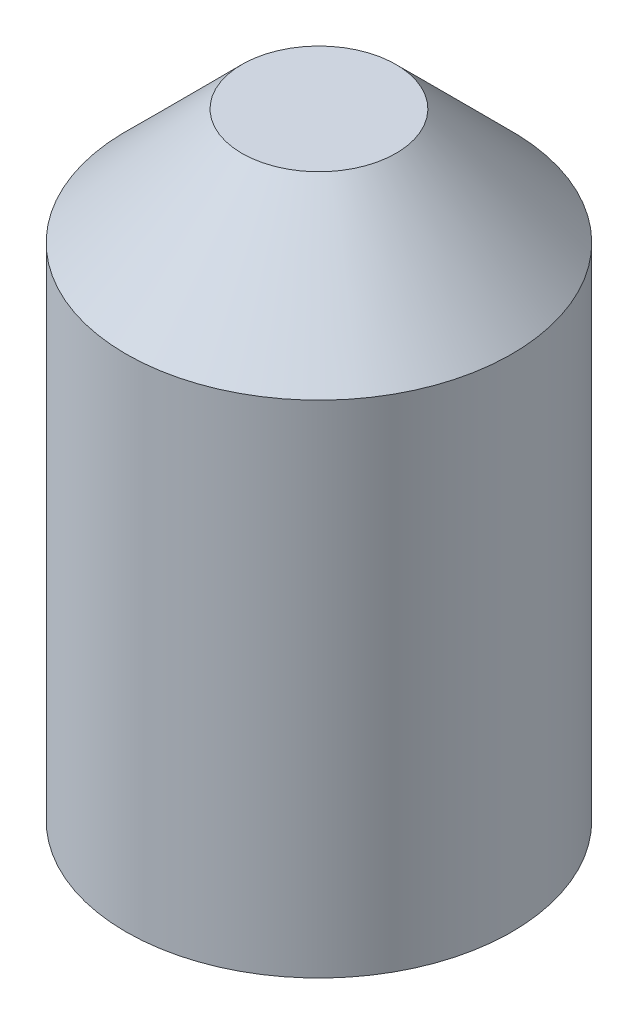
ISO-10303-21;
HEADER;
FILE_DESCRIPTION(('STEP AP214'),'2;1');
FILE_NAME('part.step','',(''),(''),'','','');
FILE_SCHEMA(('AUTOMOTIVE_DESIGN { 1 0 10303 214 1 1 1 1 }'));
ENDSEC;
DATA;
#1=APPLICATION_CONTEXT('core data for automotive mechanical design processes');
#2=APPLICATION_PROTOCOL_DEFINITION('international standard','automotive_design',2000,#1);
#3=PRODUCT_CONTEXT('',#1,'mechanical');
#4=PRODUCT('Part','Part','',(#3));
#5=PRODUCT_RELATED_PRODUCT_CATEGORY('part','',(#4));
#6=PRODUCT_DEFINITION_FORMATION('','',#4);
#7=PRODUCT_DEFINITION_CONTEXT('part definition',#1,'design');
#8=PRODUCT_DEFINITION('design','',#6,#7);
#9=PRODUCT_DEFINITION_SHAPE('','',#8);
#10=(LENGTH_UNIT() NAMED_UNIT(*) SI_UNIT(.MILLI.,.METRE.));
#11=(NAMED_UNIT(*) PLANE_ANGLE_UNIT() SI_UNIT($,.RADIAN.));
#12=(NAMED_UNIT(*) SI_UNIT($,.STERADIAN.) SOLID_ANGLE_UNIT());
#13=UNCERTAINTY_MEASURE_WITH_UNIT(LENGTH_MEASURE(1.E-05),#10,'distance_accuracy_value','');
#14=(GEOMETRIC_REPRESENTATION_CONTEXT(3) GLOBAL_UNCERTAINTY_ASSIGNED_CONTEXT((#13)) GLOBAL_UNIT_ASSIGNED_CONTEXT((#10,
#11,#12)) REPRESENTATION_CONTEXT('',''));
#15=CARTESIAN_POINT('',(0.,0.,0.));
#16=DIRECTION('',(0.,0.,1.));
#17=DIRECTION('',(1.,0.,0.));
#18=AXIS2_PLACEMENT_3D('',#15,#16,#17);
#19=CARTESIAN_POINT('',(0.,10.5221993849443,0.));
#20=DIRECTION('',(0.,-1.,0.));
#21=DIRECTION('',(0.,0.,-1.));
#22=AXIS2_PLACEMENT_3D('',#19,#20,#21);
#23=CONICAL_SURFACE('',#22,0.,1.0471975511966);
#24=CARTESIAN_POINT('',(0.,9.525,0.));
#25=DIRECTION('',(0.,1.,0.));
#26=DIRECTION('',(0.,0.,1.));
#27=AXIS2_PLACEMENT_3D('',#24,#25,#26);
#28=CIRCLE('',#27,1.7272);
#29=CARTESIAN_POINT('',(0.,9.525,1.7272));
#30=VERTEX_POINT('',#29);
#31=EDGE_CURVE('E53',#30,#30,#28,.T.);
#32=ORIENTED_EDGE('',*,*,#31,.F.);
#33=EDGE_LOOP('',(#32));
#34=FACE_BOUND('',#33,.T.);
#35=CARTESIAN_POINT('',(0.,10.5221993849443,0.));
#36=VERTEX_POINT('',#35);
#37=VERTEX_LOOP('',#36);
#38=FACE_BOUND('',#37,.T.);
#39=ADVANCED_FACE('F34',(#34,#38),#23,.F.);
#40=CARTESIAN_POINT('',(0.,12.7,0.));
#41=DIRECTION('',(0.,-1.,0.));
#42=DIRECTION('',(0.,0.,-1.));
#43=AXIS2_PLACEMENT_3D('',#40,#41,#42);
#44=PLANE('',#43);
#45=CARTESIAN_POINT('',(0.,12.7,0.));
#46=DIRECTION('',(0.,1.,0.));
#47=DIRECTION('',(0.,0.,1.));
#48=AXIS2_PLACEMENT_3D('',#45,#46,#47);
#49=CIRCLE('',#48,1.5875);
#50=CARTESIAN_POINT('',(0.,12.7,1.5875));
#51=VERTEX_POINT('',#50);
#52=EDGE_CURVE('E11',#51,#51,#49,.T.);
#53=ORIENTED_EDGE('',*,*,#52,.T.);
#54=EDGE_LOOP('',(#53));
#55=FACE_BOUND('',#54,.T.);
#56=ADVANCED_FACE('F44',(#55),#44,.F.);
#57=CARTESIAN_POINT('',(0.,10.3124,0.));
#58=DIRECTION('',(0.,-1.,0.));
#59=DIRECTION('',(0.,0.,-1.));
#60=AXIS2_PLACEMENT_3D('',#57,#58,#59);
#61=CONICAL_SURFACE('',#60,3.9751,0.78539816339745);
#62=ORIENTED_EDGE('',*,*,#52,.F.);
#63=EDGE_LOOP('',(#62));
#64=FACE_BOUND('',#63,.T.);
#65=CARTESIAN_POINT('',(0.,10.3124,0.));
#66=DIRECTION('',(0.,1.,0.));
#67=DIRECTION('',(0.,0.,1.));
#68=AXIS2_PLACEMENT_3D('',#65,#66,#67);
#69=CIRCLE('',#68,3.9751);
#70=CARTESIAN_POINT('',(0.,10.3124,3.9751));
#71=VERTEX_POINT('',#70);
#72=EDGE_CURVE('E40',#71,#71,#69,.T.);
#73=ORIENTED_EDGE('',*,*,#72,.T.);
#74=EDGE_LOOP('',(#73));
#75=FACE_BOUND('',#74,.T.);
#76=ADVANCED_FACE('F49',(#64,#75),#61,.T.);
#77=CARTESIAN_POINT('',(0.,-6.7467011517947,0.));
#78=DIRECTION('',(0.,1.,0.));
#79=DIRECTION('',(0.,0.,1.));
#80=AXIS2_PLACEMENT_3D('',#77,#78,#79);
#81=CYLINDRICAL_SURFACE('',#80,3.9751);
#82=ORIENTED_EDGE('',*,*,#72,.F.);
#83=EDGE_LOOP('',(#82));
#84=FACE_BOUND('',#83,.T.);
#85=CARTESIAN_POINT('',(0.,0.,0.));
#86=DIRECTION('',(0.,1.,0.));
#87=DIRECTION('',(0.,0.,1.));
#88=AXIS2_PLACEMENT_3D('',#85,#86,#87);
#89=CIRCLE('',#88,3.9751);
#90=CARTESIAN_POINT('',(0.,0.,3.9751));
#91=VERTEX_POINT('',#90);
#92=EDGE_CURVE('E63',#91,#91,#89,.T.);
#93=ORIENTED_EDGE('',*,*,#92,.T.);
#94=EDGE_LOOP('',(#93));
#95=FACE_BOUND('',#94,.T.);
#96=ADVANCED_FACE('F69',(#84,#95),#81,.T.);
#97=CARTESIAN_POINT('',(3.9751,0.,0.));
#98=DIRECTION('',(0.,1.,0.));
#99=DIRECTION('',(0.,0.,1.));
#100=AXIS2_PLACEMENT_3D('',#97,#98,#99);
#101=PLANE('',#100);
#102=ORIENTED_EDGE('',*,*,#92,.F.);
#103=EDGE_LOOP('',(#102));
#104=FACE_BOUND('',#103,.T.);
#105=CARTESIAN_POINT('',(0.,0.,0.));
#106=DIRECTION('',(0.,1.,0.));
#107=DIRECTION('',(0.,0.,1.));
#108=AXIS2_PLACEMENT_3D('',#105,#106,#107);
#109=CIRCLE('',#108,2.794);
#110=CARTESIAN_POINT('',(0.,0.,2.794));
#111=VERTEX_POINT('',#110);
#112=EDGE_CURVE('E58',#111,#111,#109,.T.);
#113=ORIENTED_EDGE('',*,*,#112,.T.);
#114=EDGE_LOOP('',(#113));
#115=FACE_BOUND('',#114,.T.);
#116=ADVANCED_FACE('F72',(#104,#115),#101,.F.);
#117=CARTESIAN_POINT('',(0.,1.0668,0.));
#118=DIRECTION('',(0.,-1.,0.));
#119=DIRECTION('',(0.,0.,-1.));
#120=AXIS2_PLACEMENT_3D('',#117,#118,#119);
#121=CONICAL_SURFACE('',#120,1.7272,0.78539816339745);
#122=ORIENTED_EDGE('',*,*,#112,.F.);
#123=EDGE_LOOP('',(#122));
#124=FACE_BOUND('',#123,.T.);
#125=CARTESIAN_POINT('',(0.,1.0668,0.));
#126=DIRECTION('',(0.,1.,0.));
#127=DIRECTION('',(0.,0.,1.));
#128=AXIS2_PLACEMENT_3D('',#125,#126,#127);
#129=CIRCLE('',#128,1.7272);
#130=CARTESIAN_POINT('',(0.,1.0668,1.7272));
#131=VERTEX_POINT('',#130);
#132=EDGE_CURVE('E55',#131,#131,#129,.T.);
#133=ORIENTED_EDGE('',*,*,#132,.T.);
#134=EDGE_LOOP('',(#133));
#135=FACE_BOUND('',#134,.T.);
#136=ADVANCED_FACE('F78',(#124,#135),#121,.F.);
#137=CARTESIAN_POINT('',(0.,-6.7467011517947,0.));
#138=DIRECTION('',(0.,1.,0.));
#139=DIRECTION('',(0.,0.,1.));
#140=AXIS2_PLACEMENT_3D('',#137,#138,#139);
#141=CYLINDRICAL_SURFACE('',#140,1.7272);
#142=ORIENTED_EDGE('',*,*,#132,.F.);
#143=EDGE_LOOP('',(#142));
#144=FACE_BOUND('',#143,.T.);
#145=ORIENTED_EDGE('',*,*,#31,.T.);
#146=EDGE_LOOP('',(#145));
#147=FACE_BOUND('',#146,.T.);
#148=ADVANCED_FACE('F84',(#144,#147),#141,.F.);
#149=CLOSED_SHELL('',(#39,#56,#76,#96,#116,#136,#148));
#150=MANIFOLD_SOLID_BREP('B2',#149);
#151=ADVANCED_BREP_SHAPE_REPRESENTATION('',(#18,#150),#14);
#152=SHAPE_DEFINITION_REPRESENTATION(#9,#151);
ENDSEC;
END-ISO-10303-21;
